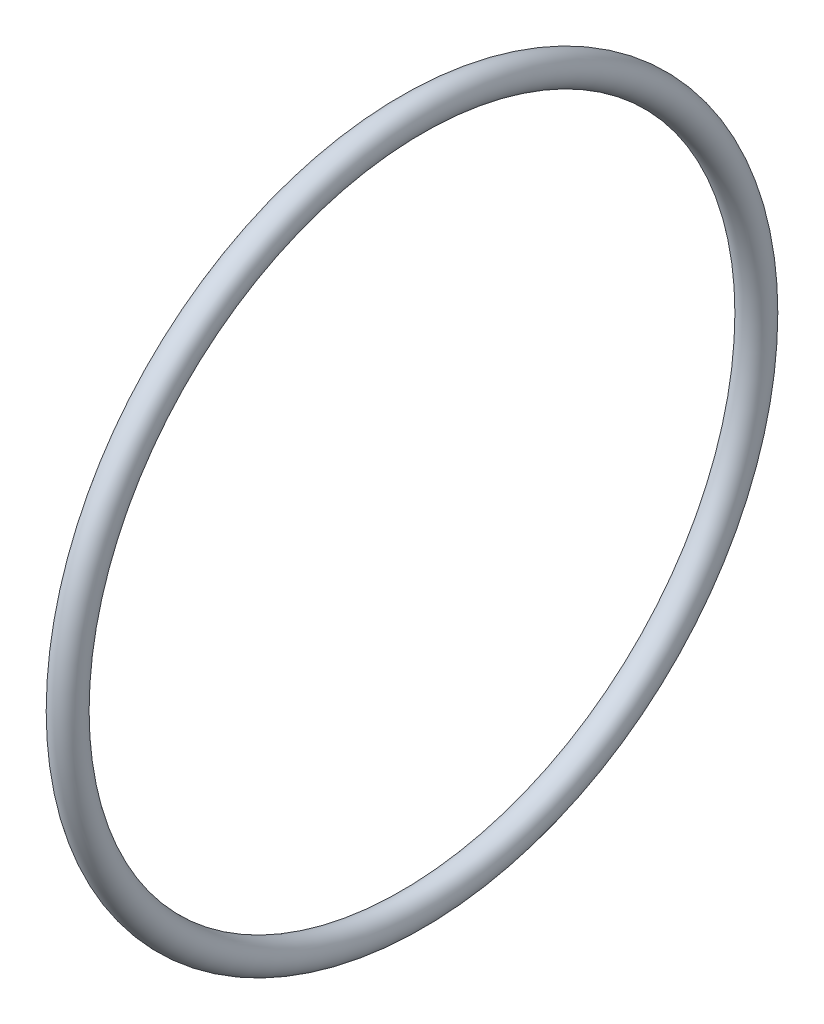
ISO-10303-21;
HEADER;
FILE_DESCRIPTION(('STEP AP214'),'2;1');
FILE_NAME('part.step','',(''),(''),'','','');
FILE_SCHEMA(('AUTOMOTIVE_DESIGN { 1 0 10303 214 1 1 1 1 }'));
ENDSEC;
DATA;
#1=APPLICATION_CONTEXT('core data for automotive mechanical design processes');
#2=APPLICATION_PROTOCOL_DEFINITION('international standard','automotive_design',2000,#1);
#3=PRODUCT_CONTEXT('',#1,'mechanical');
#4=PRODUCT('Part','Part','',(#3));
#5=PRODUCT_RELATED_PRODUCT_CATEGORY('part','',(#4));
#6=PRODUCT_DEFINITION_FORMATION('','',#4);
#7=PRODUCT_DEFINITION_CONTEXT('part definition',#1,'design');
#8=PRODUCT_DEFINITION('design','',#6,#7);
#9=PRODUCT_DEFINITION_SHAPE('','',#8);
#10=(LENGTH_UNIT() NAMED_UNIT(*) SI_UNIT(.MILLI.,.METRE.));
#11=(NAMED_UNIT(*) PLANE_ANGLE_UNIT() SI_UNIT($,.RADIAN.));
#12=(NAMED_UNIT(*) SI_UNIT($,.STERADIAN.) SOLID_ANGLE_UNIT());
#13=UNCERTAINTY_MEASURE_WITH_UNIT(LENGTH_MEASURE(1.E-05),#10,'distance_accuracy_value','');
#14=(GEOMETRIC_REPRESENTATION_CONTEXT(3) GLOBAL_UNCERTAINTY_ASSIGNED_CONTEXT((#13)) GLOBAL_UNIT_ASSIGNED_CONTEXT((#10,
#11,#12)) REPRESENTATION_CONTEXT('',''));
#15=CARTESIAN_POINT('',(0.,0.,0.));
#16=DIRECTION('',(0.,0.,1.));
#17=DIRECTION('',(1.,0.,0.));
#18=AXIS2_PLACEMENT_3D('',#15,#16,#17);
#19=CARTESIAN_POINT('',(0.,0.,0.));
#20=DIRECTION('',(-1.,0.,0.));
#21=DIRECTION('',(0.,0.,1.));
#22=AXIS2_PLACEMENT_3D('',#19,#20,#21);
#23=TOROIDAL_SURFACE('',#22,36.,1.5875);
#24=CARTESIAN_POINT('',(0.,0.,37.5875));
#25=VERTEX_POINT('',#24);
#26=VERTEX_LOOP('',#25);
#27=FACE_BOUND('',#26,.T.);
#28=ADVANCED_FACE('F30',(#27),#23,.T.);
#29=CLOSED_SHELL('',(#28));
#30=MANIFOLD_SOLID_BREP('B2',#29);
#31=ADVANCED_BREP_SHAPE_REPRESENTATION('',(#18,#30),#14);
#32=SHAPE_DEFINITION_REPRESENTATION(#9,#31);
ENDSEC;
END-ISO-10303-21;
